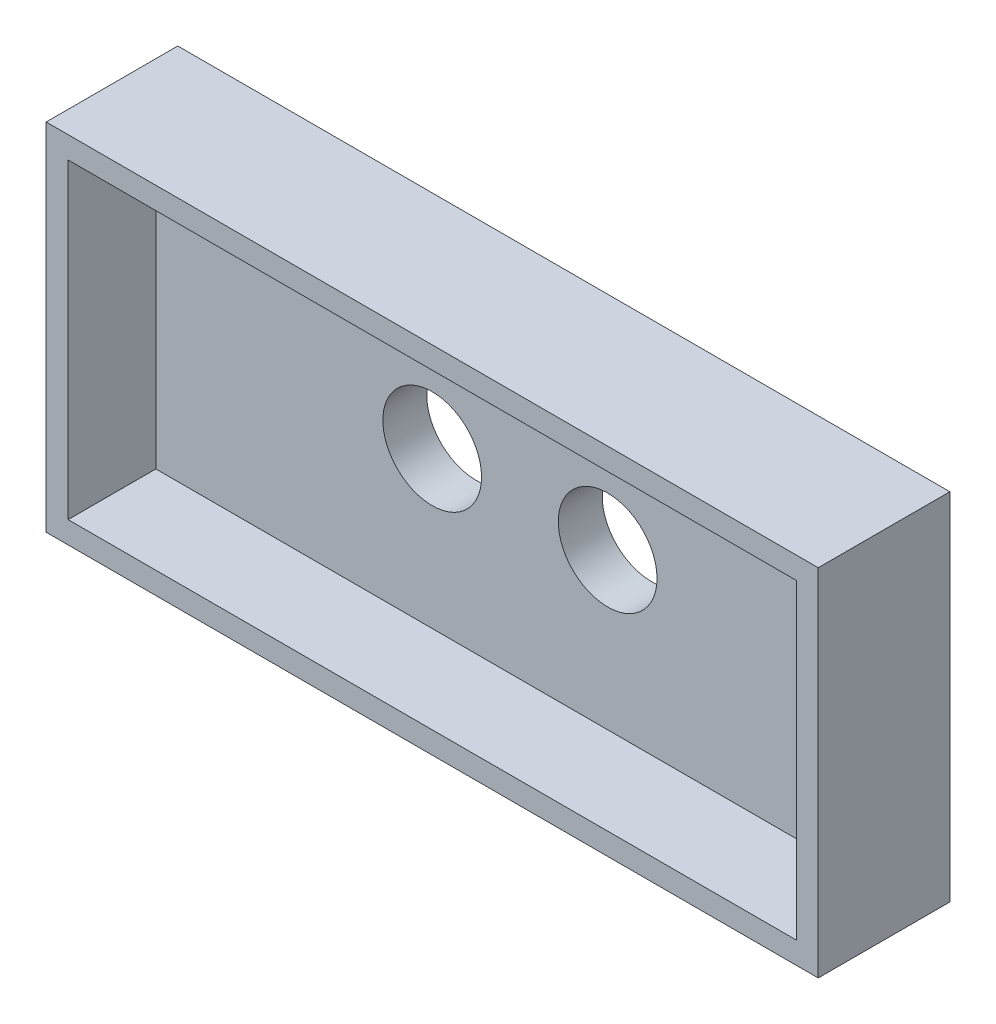
ISO-10303-21;
HEADER;
FILE_DESCRIPTION(('STEP AP214'),'2;1');
FILE_NAME('part.step','',(''),(''),'','','');
FILE_SCHEMA(('AUTOMOTIVE_DESIGN { 1 0 10303 214 1 1 1 1 }'));
ENDSEC;
DATA;
#1=APPLICATION_CONTEXT('core data for automotive mechanical design processes');
#2=APPLICATION_PROTOCOL_DEFINITION('international standard','automotive_design',2000,#1);
#3=PRODUCT_CONTEXT('',#1,'mechanical');
#4=PRODUCT('Part','Part','',(#3));
#5=PRODUCT_RELATED_PRODUCT_CATEGORY('part','',(#4));
#6=PRODUCT_DEFINITION_FORMATION('','',#4);
#7=PRODUCT_DEFINITION_CONTEXT('part definition',#1,'design');
#8=PRODUCT_DEFINITION('design','',#6,#7);
#9=PRODUCT_DEFINITION_SHAPE('','',#8);
#10=(LENGTH_UNIT() NAMED_UNIT(*) SI_UNIT(.MILLI.,.METRE.));
#11=(NAMED_UNIT(*) PLANE_ANGLE_UNIT() SI_UNIT($,.RADIAN.));
#12=(NAMED_UNIT(*) SI_UNIT($,.STERADIAN.) SOLID_ANGLE_UNIT());
#13=UNCERTAINTY_MEASURE_WITH_UNIT(LENGTH_MEASURE(1.E-05),#10,'distance_accuracy_value','');
#14=(GEOMETRIC_REPRESENTATION_CONTEXT(3) GLOBAL_UNCERTAINTY_ASSIGNED_CONTEXT((#13)) GLOBAL_UNIT_ASSIGNED_CONTEXT((#10,
#11,#12)) REPRESENTATION_CONTEXT('',''));
#15=CARTESIAN_POINT('',(0.,0.,0.));
#16=DIRECTION('',(0.,0.,1.));
#17=DIRECTION('',(1.,0.,0.));
#18=AXIS2_PLACEMENT_3D('',#15,#16,#17);
#19=CARTESIAN_POINT('',(0.,-51.435,-12.7));
#20=DIRECTION('',(0.,1.,0.));
#21=DIRECTION('',(0.,0.,1.));
#22=AXIS2_PLACEMENT_3D('',#19,#20,#21);
#23=PLANE('',#22);
#24=DIRECTION('',(0.,0.,1.));
#25=VECTOR('',#24,1.);
#26=CARTESIAN_POINT('',(111.76,-51.435,-12.7));
#27=LINE('',#26,#25);
#28=CARTESIAN_POINT('',(111.76,-51.435,-12.7));
#29=VERTEX_POINT('',#28);
#30=CARTESIAN_POINT('',(111.76,-51.435,25.4));
#31=VERTEX_POINT('',#30);
#32=EDGE_CURVE('E155',#29,#31,#27,.T.);
#33=ORIENTED_EDGE('',*,*,#32,.T.);
#34=DIRECTION('',(-1.,0.,0.));
#35=VECTOR('',#34,1.);
#36=CARTESIAN_POINT('',(0.,-51.435,25.4));
#37=LINE('',#36,#35);
#38=CARTESIAN_POINT('',(-111.76,-51.435,25.4));
#39=VERTEX_POINT('',#38);
#40=EDGE_CURVE('E174',#31,#39,#37,.T.);
#41=ORIENTED_EDGE('',*,*,#40,.T.);
#42=DIRECTION('',(0.,0.,1.));
#43=VECTOR('',#42,1.);
#44=CARTESIAN_POINT('',(-111.76,-51.435,-12.7));
#45=LINE('',#44,#43);
#46=CARTESIAN_POINT('',(-111.76,-51.435,-12.7));
#47=VERTEX_POINT('',#46);
#48=EDGE_CURVE('E11',#47,#39,#45,.T.);
#49=ORIENTED_EDGE('',*,*,#48,.F.);
#50=DIRECTION('',(-1.,0.,0.));
#51=VECTOR('',#50,1.);
#52=CARTESIAN_POINT('',(0.,-51.435,-12.7));
#53=LINE('',#52,#51);
#54=EDGE_CURVE('E73',#29,#47,#53,.T.);
#55=ORIENTED_EDGE('',*,*,#54,.F.);
#56=EDGE_LOOP('',(#33,#41,#49,#55));
#57=FACE_BOUND('',#56,.T.);
#58=ADVANCED_FACE('F47',(#57),#23,.F.);
#59=CARTESIAN_POINT('',(-111.76,0.,-12.7));
#60=DIRECTION('',(-1.,0.,0.));
#61=DIRECTION('',(0.,-1.,0.));
#62=AXIS2_PLACEMENT_3D('',#59,#60,#61);
#63=PLANE('',#62);
#64=ORIENTED_EDGE('',*,*,#48,.T.);
#65=DIRECTION('',(0.,-1.,0.));
#66=VECTOR('',#65,1.);
#67=CARTESIAN_POINT('',(-111.76,0.,25.4));
#68=LINE('',#67,#66);
#69=CARTESIAN_POINT('',(-111.76,51.435,25.4));
#70=VERTEX_POINT('',#69);
#71=EDGE_CURVE('E196',#70,#39,#68,.T.);
#72=ORIENTED_EDGE('',*,*,#71,.F.);
#73=DIRECTION('',(0.,0.,1.));
#74=VECTOR('',#73,1.);
#75=CARTESIAN_POINT('',(-111.76,51.435,-12.7));
#76=LINE('',#75,#74);
#77=CARTESIAN_POINT('',(-111.76,51.435,-12.7));
#78=VERTEX_POINT('',#77);
#79=EDGE_CURVE('E57',#78,#70,#76,.T.);
#80=ORIENTED_EDGE('',*,*,#79,.F.);
#81=DIRECTION('',(0.,-1.,0.));
#82=VECTOR('',#81,1.);
#83=CARTESIAN_POINT('',(-111.76,0.,-12.7));
#84=LINE('',#83,#82);
#85=EDGE_CURVE('E137',#78,#47,#84,.T.);
#86=ORIENTED_EDGE('',*,*,#85,.T.);
#87=EDGE_LOOP('',(#64,#72,#80,#86));
#88=FACE_BOUND('',#87,.T.);
#89=ADVANCED_FACE('F214',(#88),#63,.T.);
#90=CARTESIAN_POINT('',(0.,51.435,-12.7));
#91=DIRECTION('',(0.,-1.,0.));
#92=DIRECTION('',(1.,0.,0.));
#93=AXIS2_PLACEMENT_3D('',#90,#91,#92);
#94=PLANE('',#93);
#95=ORIENTED_EDGE('',*,*,#79,.T.);
#96=DIRECTION('',(1.,0.,0.));
#97=VECTOR('',#96,1.);
#98=CARTESIAN_POINT('',(0.,51.435,25.4));
#99=LINE('',#98,#97);
#100=CARTESIAN_POINT('',(111.76,51.435,25.4));
#101=VERTEX_POINT('',#100);
#102=EDGE_CURVE('E192',#70,#101,#99,.T.);
#103=ORIENTED_EDGE('',*,*,#102,.T.);
#104=DIRECTION('',(0.,0.,1.));
#105=VECTOR('',#104,1.);
#106=CARTESIAN_POINT('',(111.76,51.435,-12.7));
#107=LINE('',#106,#105);
#108=CARTESIAN_POINT('',(111.76,51.435,-12.7));
#109=VERTEX_POINT('',#108);
#110=EDGE_CURVE('E152',#109,#101,#107,.T.);
#111=ORIENTED_EDGE('',*,*,#110,.F.);
#112=DIRECTION('',(1.,0.,0.));
#113=VECTOR('',#112,1.);
#114=CARTESIAN_POINT('',(0.,51.435,-12.7));
#115=LINE('',#114,#113);
#116=EDGE_CURVE('E142',#78,#109,#115,.T.);
#117=ORIENTED_EDGE('',*,*,#116,.F.);
#118=EDGE_LOOP('',(#95,#103,#111,#117));
#119=FACE_BOUND('',#118,.T.);
#120=ADVANCED_FACE('F217',(#119),#94,.F.);
#121=CARTESIAN_POINT('',(105.41,4.60742555219437E-13,-12.7));
#122=DIRECTION('',(1.,0.,0.));
#123=DIRECTION('',(0.,1.,0.));
#124=AXIS2_PLACEMENT_3D('',#121,#122,#123);
#125=PLANE('',#124);
#126=DIRECTION('',(0.,0.,1.));
#127=VECTOR('',#126,1.);
#128=CARTESIAN_POINT('',(105.41,45.085,-12.7));
#129=LINE('',#128,#127);
#130=CARTESIAN_POINT('',(105.41,45.085,0.));
#131=VERTEX_POINT('',#130);
#132=CARTESIAN_POINT('',(105.41,45.085,25.4));
#133=VERTEX_POINT('',#132);
#134=EDGE_CURVE('E127',#131,#133,#129,.T.);
#135=ORIENTED_EDGE('',*,*,#134,.F.);
#136=DIRECTION('',(0.,1.,0.));
#137=VECTOR('',#136,1.);
#138=CARTESIAN_POINT('',(105.41,0.,0.));
#139=LINE('',#138,#137);
#140=CARTESIAN_POINT('',(105.41,-45.085,0.));
#141=VERTEX_POINT('',#140);
#142=EDGE_CURVE('E115',#141,#131,#139,.T.);
#143=ORIENTED_EDGE('',*,*,#142,.F.);
#144=DIRECTION('',(0.,0.,1.));
#145=VECTOR('',#144,1.);
#146=CARTESIAN_POINT('',(105.41,-45.085,-12.7));
#147=LINE('',#146,#145);
#148=CARTESIAN_POINT('',(105.41,-45.085,25.4));
#149=VERTEX_POINT('',#148);
#150=EDGE_CURVE('E51',#141,#149,#147,.T.);
#151=ORIENTED_EDGE('',*,*,#150,.T.);
#152=DIRECTION('',(0.,1.,0.));
#153=VECTOR('',#152,1.);
#154=CARTESIAN_POINT('',(105.41,4.60742555219437E-13,25.4));
#155=LINE('',#154,#153);
#156=EDGE_CURVE('E181',#149,#133,#155,.T.);
#157=ORIENTED_EDGE('',*,*,#156,.T.);
#158=EDGE_LOOP('',(#135,#143,#151,#157));
#159=FACE_BOUND('',#158,.T.);
#160=ADVANCED_FACE('F49',(#159),#125,.F.);
#161=CARTESIAN_POINT('',(0.,45.085,-12.7));
#162=DIRECTION('',(0.,-1.,0.));
#163=DIRECTION('',(1.,0.,0.));
#164=AXIS2_PLACEMENT_3D('',#161,#162,#163);
#165=PLANE('',#164);
#166=DIRECTION('',(1.,0.,0.));
#167=VECTOR('',#166,1.);
#168=CARTESIAN_POINT('',(0.,45.085,0.));
#169=LINE('',#168,#167);
#170=CARTESIAN_POINT('',(-105.41,45.085,0.));
#171=VERTEX_POINT('',#170);
#172=EDGE_CURVE('E129',#171,#131,#169,.T.);
#173=ORIENTED_EDGE('',*,*,#172,.T.);
#174=ORIENTED_EDGE('',*,*,#134,.T.);
#175=DIRECTION('',(1.,0.,0.));
#176=VECTOR('',#175,1.);
#177=CARTESIAN_POINT('',(0.,45.085,25.4));
#178=LINE('',#177,#176);
#179=CARTESIAN_POINT('',(-105.41,45.085,25.4));
#180=VERTEX_POINT('',#179);
#181=EDGE_CURVE('E170',#180,#133,#178,.T.);
#182=ORIENTED_EDGE('',*,*,#181,.F.);
#183=DIRECTION('',(0.,0.,1.));
#184=VECTOR('',#183,1.);
#185=CARTESIAN_POINT('',(-105.41,45.085,-12.7));
#186=LINE('',#185,#184);
#187=EDGE_CURVE('E140',#171,#180,#186,.T.);
#188=ORIENTED_EDGE('',*,*,#187,.F.);
#189=EDGE_LOOP('',(#173,#174,#182,#188));
#190=FACE_BOUND('',#189,.T.);
#191=ADVANCED_FACE('F171',(#190),#165,.T.);
#192=CARTESIAN_POINT('',(-105.41,0.,-12.7));
#193=DIRECTION('',(-1.,0.,0.));
#194=DIRECTION('',(0.,0.,1.));
#195=AXIS2_PLACEMENT_3D('',#192,#193,#194);
#196=PLANE('',#195);
#197=DIRECTION('',(0.,0.,1.));
#198=VECTOR('',#197,1.);
#199=CARTESIAN_POINT('',(-105.41,-45.085,-12.7));
#200=LINE('',#199,#198);
#201=CARTESIAN_POINT('',(-105.41,-45.085,0.));
#202=VERTEX_POINT('',#201);
#203=CARTESIAN_POINT('',(-105.41,-45.085,25.4));
#204=VERTEX_POINT('',#203);
#205=EDGE_CURVE('E136',#202,#204,#200,.T.);
#206=ORIENTED_EDGE('',*,*,#205,.F.);
#207=DIRECTION('',(0.,1.,0.));
#208=VECTOR('',#207,1.);
#209=CARTESIAN_POINT('',(-105.41,0.,0.));
#210=LINE('',#209,#208);
#211=EDGE_CURVE('E65',#202,#171,#210,.T.);
#212=ORIENTED_EDGE('',*,*,#211,.T.);
#213=ORIENTED_EDGE('',*,*,#187,.T.);
#214=DIRECTION('',(0.,-1.,0.));
#215=VECTOR('',#214,1.);
#216=CARTESIAN_POINT('',(-105.41,0.,25.4));
#217=LINE('',#216,#215);
#218=EDGE_CURVE('E167',#180,#204,#217,.T.);
#219=ORIENTED_EDGE('',*,*,#218,.T.);
#220=EDGE_LOOP('',(#206,#212,#213,#219));
#221=FACE_BOUND('',#220,.T.);
#222=ADVANCED_FACE('F165',(#221),#196,.F.);
#223=CARTESIAN_POINT('',(0.,-45.085,-12.7));
#224=DIRECTION('',(0.,-1.,0.));
#225=DIRECTION('',(1.,0.,0.));
#226=AXIS2_PLACEMENT_3D('',#223,#224,#225);
#227=PLANE('',#226);
#228=ORIENTED_EDGE('',*,*,#150,.F.);
#229=DIRECTION('',(1.,0.,0.));
#230=VECTOR('',#229,1.);
#231=CARTESIAN_POINT('',(0.,-45.085,0.));
#232=LINE('',#231,#230);
#233=EDGE_CURVE('E112',#202,#141,#232,.T.);
#234=ORIENTED_EDGE('',*,*,#233,.F.);
#235=ORIENTED_EDGE('',*,*,#205,.T.);
#236=DIRECTION('',(1.,0.,0.));
#237=VECTOR('',#236,1.);
#238=CARTESIAN_POINT('',(0.,-45.085,25.4));
#239=LINE('',#238,#237);
#240=EDGE_CURVE('E134',#204,#149,#239,.T.);
#241=ORIENTED_EDGE('',*,*,#240,.T.);
#242=EDGE_LOOP('',(#228,#234,#235,#241));
#243=FACE_BOUND('',#242,.T.);
#244=ADVANCED_FACE('F132',(#243),#227,.F.);
#245=CARTESIAN_POINT('',(111.76,0.,-12.7));
#246=DIRECTION('',(-1.,0.,0.));
#247=DIRECTION('',(0.,-1.,0.));
#248=AXIS2_PLACEMENT_3D('',#245,#246,#247);
#249=PLANE('',#248);
#250=ORIENTED_EDGE('',*,*,#110,.T.);
#251=DIRECTION('',(0.,-1.,0.));
#252=VECTOR('',#251,1.);
#253=CARTESIAN_POINT('',(111.76,0.,25.4));
#254=LINE('',#253,#252);
#255=EDGE_CURVE('E188',#101,#31,#254,.T.);
#256=ORIENTED_EDGE('',*,*,#255,.T.);
#257=ORIENTED_EDGE('',*,*,#32,.F.);
#258=DIRECTION('',(0.,-1.,0.));
#259=VECTOR('',#258,1.);
#260=CARTESIAN_POINT('',(111.76,0.,-12.7));
#261=LINE('',#260,#259);
#262=EDGE_CURVE('E146',#109,#29,#261,.T.);
#263=ORIENTED_EDGE('',*,*,#262,.F.);
#264=EDGE_LOOP('',(#250,#256,#257,#263));
#265=FACE_BOUND('',#264,.T.);
#266=ADVANCED_FACE('F209',(#265),#249,.F.);
#267=CARTESIAN_POINT('',(0.,0.,-12.7));
#268=DIRECTION('',(0.,0.,1.));
#269=DIRECTION('',(1.,0.,0.));
#270=AXIS2_PLACEMENT_3D('',#267,#268,#269);
#271=PLANE('',#270);
#272=ORIENTED_EDGE('',*,*,#54,.T.);
#273=ORIENTED_EDGE('',*,*,#85,.F.);
#274=ORIENTED_EDGE('',*,*,#116,.T.);
#275=ORIENTED_EDGE('',*,*,#262,.T.);
#276=EDGE_LOOP('',(#272,#273,#274,#275));
#277=FACE_BOUND('',#276,.T.);
#278=CARTESIAN_POINT('',(25.4,0.,-12.7));
#279=DIRECTION('',(0.,0.,1.));
#280=DIRECTION('',(1.,0.,0.));
#281=AXIS2_PLACEMENT_3D('',#278,#279,#280);
#282=CIRCLE('',#281,14.2875);
#283=CARTESIAN_POINT('',(39.6875,0.,-12.7));
#284=VERTEX_POINT('',#283);
#285=EDGE_CURVE('E275',#284,#284,#282,.T.);
#286=ORIENTED_EDGE('',*,*,#285,.T.);
#287=EDGE_LOOP('',(#286));
#288=FACE_BOUND('',#287,.T.);
#289=CARTESIAN_POINT('',(-25.4,0.,-12.7));
#290=DIRECTION('',(0.,0.,1.));
#291=DIRECTION('',(1.,0.,0.));
#292=AXIS2_PLACEMENT_3D('',#289,#290,#291);
#293=CIRCLE('',#292,14.2875);
#294=CARTESIAN_POINT('',(-11.1125,0.,-12.7));
#295=VERTEX_POINT('',#294);
#296=EDGE_CURVE('E277',#295,#295,#293,.T.);
#297=ORIENTED_EDGE('',*,*,#296,.T.);
#298=EDGE_LOOP('',(#297));
#299=FACE_BOUND('',#298,.T.);
#300=ADVANCED_FACE('F204',(#277,#288,#299),#271,.F.);
#301=CARTESIAN_POINT('',(0.,0.,25.4));
#302=DIRECTION('',(0.,0.,1.));
#303=DIRECTION('',(1.,0.,0.));
#304=AXIS2_PLACEMENT_3D('',#301,#302,#303);
#305=PLANE('',#304);
#306=ORIENTED_EDGE('',*,*,#156,.F.);
#307=ORIENTED_EDGE('',*,*,#240,.F.);
#308=ORIENTED_EDGE('',*,*,#218,.F.);
#309=ORIENTED_EDGE('',*,*,#181,.T.);
#310=EDGE_LOOP('',(#306,#307,#308,#309));
#311=FACE_BOUND('',#310,.T.);
#312=ORIENTED_EDGE('',*,*,#40,.F.);
#313=ORIENTED_EDGE('',*,*,#255,.F.);
#314=ORIENTED_EDGE('',*,*,#102,.F.);
#315=ORIENTED_EDGE('',*,*,#71,.T.);
#316=EDGE_LOOP('',(#312,#313,#314,#315));
#317=FACE_BOUND('',#316,.T.);
#318=ADVANCED_FACE('F176',(#311,#317),#305,.T.);
#319=CARTESIAN_POINT('',(-25.4,0.,-12.7));
#320=DIRECTION('',(0.,0.,1.));
#321=DIRECTION('',(1.,0.,0.));
#322=AXIS2_PLACEMENT_3D('',#319,#320,#321);
#323=CYLINDRICAL_SURFACE('',#322,14.2875);
#324=ORIENTED_EDGE('',*,*,#296,.F.);
#325=EDGE_LOOP('',(#324));
#326=FACE_BOUND('',#325,.T.);
#327=CARTESIAN_POINT('',(-25.4,0.,0.));
#328=DIRECTION('',(0.,0.,1.));
#329=DIRECTION('',(1.,0.,0.));
#330=AXIS2_PLACEMENT_3D('',#327,#328,#329);
#331=CIRCLE('',#330,14.2875);
#332=CARTESIAN_POINT('',(-11.1125,0.,0.));
#333=VERTEX_POINT('',#332);
#334=EDGE_CURVE('E121',#333,#333,#331,.T.);
#335=ORIENTED_EDGE('',*,*,#334,.T.);
#336=EDGE_LOOP('',(#335));
#337=FACE_BOUND('',#336,.T.);
#338=ADVANCED_FACE('F246',(#326,#337),#323,.F.);
#339=CARTESIAN_POINT('',(25.4,0.,-12.7));
#340=DIRECTION('',(0.,0.,1.));
#341=DIRECTION('',(1.,0.,0.));
#342=AXIS2_PLACEMENT_3D('',#339,#340,#341);
#343=CYLINDRICAL_SURFACE('',#342,14.2875);
#344=ORIENTED_EDGE('',*,*,#285,.F.);
#345=EDGE_LOOP('',(#344));
#346=FACE_BOUND('',#345,.T.);
#347=CARTESIAN_POINT('',(25.4,0.,0.));
#348=DIRECTION('',(0.,0.,1.));
#349=DIRECTION('',(1.,0.,0.));
#350=AXIS2_PLACEMENT_3D('',#347,#348,#349);
#351=CIRCLE('',#350,14.2875);
#352=CARTESIAN_POINT('',(39.6875,0.,0.));
#353=VERTEX_POINT('',#352);
#354=EDGE_CURVE('E262',#353,#353,#351,.T.);
#355=ORIENTED_EDGE('',*,*,#354,.T.);
#356=EDGE_LOOP('',(#355));
#357=FACE_BOUND('',#356,.T.);
#358=ADVANCED_FACE('F249',(#346,#357),#343,.F.);
#359=CARTESIAN_POINT('',(0.,0.,0.));
#360=DIRECTION('',(0.,0.,1.));
#361=DIRECTION('',(1.,0.,0.));
#362=AXIS2_PLACEMENT_3D('',#359,#360,#361);
#363=PLANE('',#362);
#364=ORIENTED_EDGE('',*,*,#354,.F.);
#365=EDGE_LOOP('',(#364));
#366=FACE_BOUND('',#365,.T.);
#367=ORIENTED_EDGE('',*,*,#334,.F.);
#368=EDGE_LOOP('',(#367));
#369=FACE_BOUND('',#368,.T.);
#370=ORIENTED_EDGE('',*,*,#233,.T.);
#371=ORIENTED_EDGE('',*,*,#142,.T.);
#372=ORIENTED_EDGE('',*,*,#172,.F.);
#373=ORIENTED_EDGE('',*,*,#211,.F.);
#374=EDGE_LOOP('',(#370,#371,#372,#373));
#375=FACE_BOUND('',#374,.T.);
#376=ADVANCED_FACE('F114',(#366,#369,#375),#363,.T.);
#377=CLOSED_SHELL('',(#58,#89,#120,#160,#191,#222,#244,#266,#300,#318,#338,#358,#376));
#378=MANIFOLD_SOLID_BREP('B2',#377);
#379=ADVANCED_BREP_SHAPE_REPRESENTATION('',(#18,#378),#14);
#380=SHAPE_DEFINITION_REPRESENTATION(#9,#379);
ENDSEC;
END-ISO-10303-21;
